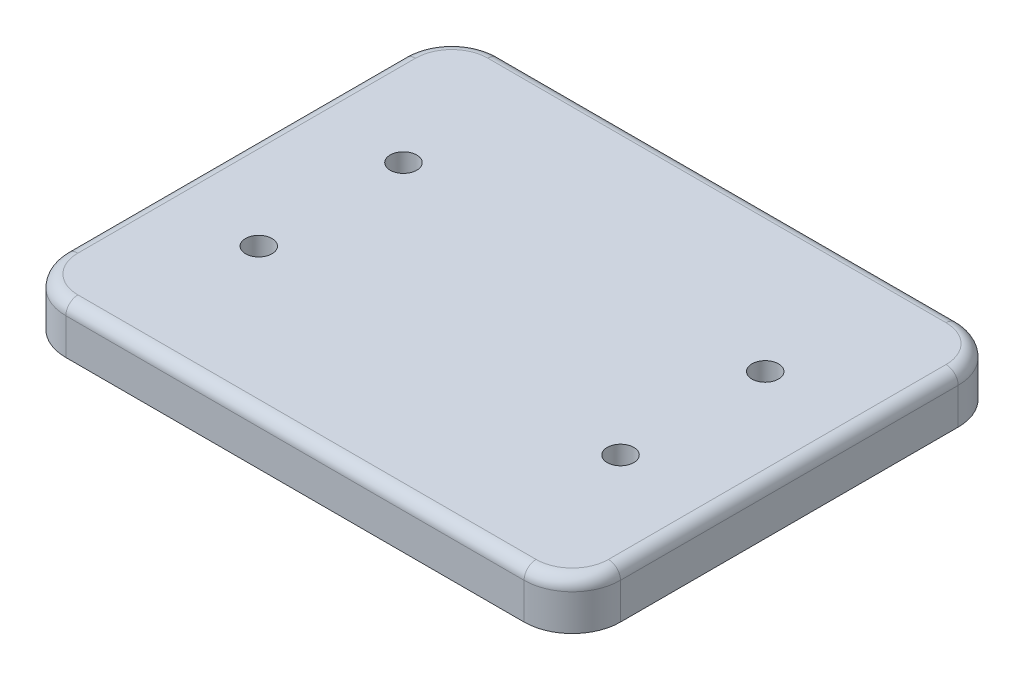
ISO-10303-21;
HEADER;
FILE_DESCRIPTION(('STEP AP214'),'2;1');
FILE_NAME('part.step','',(''),(''),'','','');
FILE_SCHEMA(('AUTOMOTIVE_DESIGN { 1 0 10303 214 1 1 1 1 }'));
ENDSEC;
DATA;
#1=APPLICATION_CONTEXT('core data for automotive mechanical design processes');
#2=APPLICATION_PROTOCOL_DEFINITION('international standard','automotive_design',2000,#1);
#3=PRODUCT_CONTEXT('',#1,'mechanical');
#4=PRODUCT('Part','Part','',(#3));
#5=PRODUCT_RELATED_PRODUCT_CATEGORY('part','',(#4));
#6=PRODUCT_DEFINITION_FORMATION('','',#4);
#7=PRODUCT_DEFINITION_CONTEXT('part definition',#1,'design');
#8=PRODUCT_DEFINITION('design','',#6,#7);
#9=PRODUCT_DEFINITION_SHAPE('','',#8);
#10=(LENGTH_UNIT() NAMED_UNIT(*) SI_UNIT(.MILLI.,.METRE.));
#11=(NAMED_UNIT(*) PLANE_ANGLE_UNIT() SI_UNIT($,.RADIAN.));
#12=(NAMED_UNIT(*) SI_UNIT($,.STERADIAN.) SOLID_ANGLE_UNIT());
#13=UNCERTAINTY_MEASURE_WITH_UNIT(LENGTH_MEASURE(1.E-05),#10,'distance_accuracy_value','');
#14=(GEOMETRIC_REPRESENTATION_CONTEXT(3) GLOBAL_UNCERTAINTY_ASSIGNED_CONTEXT((#13)) GLOBAL_UNIT_ASSIGNED_CONTEXT((#10,
#11,#12)) REPRESENTATION_CONTEXT('',''));
#15=CARTESIAN_POINT('',(0.,0.,0.));
#16=DIRECTION('',(0.,0.,1.));
#17=DIRECTION('',(1.,0.,0.));
#18=AXIS2_PLACEMENT_3D('',#15,#16,#17);
#19=CARTESIAN_POINT('',(75.,36.,30.));
#20=DIRECTION('',(0.,-1.,0.));
#21=DIRECTION('',(0.,0.,-1.));
#22=AXIS2_PLACEMENT_3D('',#19,#20,#21);
#23=CYLINDRICAL_SURFACE('',#22,5.49999999999999);
#24=CARTESIAN_POINT('',(75.,20.,30.));
#25=DIRECTION('',(0.,-1.,0.));
#26=DIRECTION('',(0.,0.,-1.));
#27=AXIS2_PLACEMENT_3D('',#24,#25,#26);
#28=CIRCLE('',#27,5.49999999999999);
#29=CARTESIAN_POINT('',(75.,20.,24.5));
#30=VERTEX_POINT('',#29);
#31=EDGE_CURVE('E250',#30,#30,#28,.T.);
#32=ORIENTED_EDGE('',*,*,#31,.F.);
#33=EDGE_LOOP('',(#32));
#34=FACE_BOUND('',#33,.T.);
#35=CARTESIAN_POINT('',(75.,11.,30.));
#36=DIRECTION('',(0.,-1.,0.));
#37=DIRECTION('',(0.,0.,-1.));
#38=AXIS2_PLACEMENT_3D('',#35,#36,#37);
#39=CIRCLE('',#38,5.49999999999999);
#40=CARTESIAN_POINT('',(75.,11.,24.5));
#41=VERTEX_POINT('',#40);
#42=EDGE_CURVE('E46',#41,#41,#39,.F.);
#43=ORIENTED_EDGE('',*,*,#42,.F.);
#44=EDGE_LOOP('',(#43));
#45=FACE_BOUND('',#44,.T.);
#46=ADVANCED_FACE('F42',(#34,#45),#23,.F.);
#47=CARTESIAN_POINT('',(-75.,36.,30.));
#48=DIRECTION('',(0.,-1.,0.));
#49=DIRECTION('',(0.,0.,-1.));
#50=AXIS2_PLACEMENT_3D('',#47,#48,#49);
#51=CYLINDRICAL_SURFACE('',#50,5.5);
#52=CARTESIAN_POINT('',(-75.,20.,30.));
#53=DIRECTION('',(0.,-1.,0.));
#54=DIRECTION('',(0.,0.,-1.));
#55=AXIS2_PLACEMENT_3D('',#52,#53,#54);
#56=CIRCLE('',#55,5.5);
#57=CARTESIAN_POINT('',(-75.,20.,24.5));
#58=VERTEX_POINT('',#57);
#59=EDGE_CURVE('E267',#58,#58,#56,.T.);
#60=ORIENTED_EDGE('',*,*,#59,.F.);
#61=EDGE_LOOP('',(#60));
#62=FACE_BOUND('',#61,.T.);
#63=CARTESIAN_POINT('',(-75.,11.,30.));
#64=DIRECTION('',(0.,-1.,0.));
#65=DIRECTION('',(0.,0.,-1.));
#66=AXIS2_PLACEMENT_3D('',#63,#64,#65);
#67=CIRCLE('',#66,5.5);
#68=CARTESIAN_POINT('',(-75.,11.,24.5));
#69=VERTEX_POINT('',#68);
#70=EDGE_CURVE('E244',#69,#69,#67,.F.);
#71=ORIENTED_EDGE('',*,*,#70,.F.);
#72=EDGE_LOOP('',(#71));
#73=FACE_BOUND('',#72,.T.);
#74=ADVANCED_FACE('F354',(#62,#73),#51,.F.);
#75=CARTESIAN_POINT('',(75.,36.,-30.));
#76=DIRECTION('',(0.,-1.,0.));
#77=DIRECTION('',(0.,0.,-1.));
#78=AXIS2_PLACEMENT_3D('',#75,#76,#77);
#79=CYLINDRICAL_SURFACE('',#78,5.49999999999999);
#80=CARTESIAN_POINT('',(75.,20.,-30.));
#81=DIRECTION('',(0.,-1.,0.));
#82=DIRECTION('',(0.,0.,-1.));
#83=AXIS2_PLACEMENT_3D('',#80,#81,#82);
#84=CIRCLE('',#83,5.49999999999999);
#85=CARTESIAN_POINT('',(75.,20.,-35.5));
#86=VERTEX_POINT('',#85);
#87=EDGE_CURVE('E243',#86,#86,#84,.F.);
#88=ORIENTED_EDGE('',*,*,#87,.T.);
#89=EDGE_LOOP('',(#88));
#90=FACE_BOUND('',#89,.T.);
#91=CARTESIAN_POINT('',(75.,11.,-30.));
#92=DIRECTION('',(0.,-1.,0.));
#93=DIRECTION('',(0.,0.,-1.));
#94=AXIS2_PLACEMENT_3D('',#91,#92,#93);
#95=CIRCLE('',#94,5.49999999999999);
#96=CARTESIAN_POINT('',(75.,11.,-35.5));
#97=VERTEX_POINT('',#96);
#98=EDGE_CURVE('E240',#97,#97,#95,.T.);
#99=ORIENTED_EDGE('',*,*,#98,.T.);
#100=EDGE_LOOP('',(#99));
#101=FACE_BOUND('',#100,.T.);
#102=ADVANCED_FACE('F360',(#90,#101),#79,.F.);
#103=CARTESIAN_POINT('',(-75.,36.,-30.));
#104=DIRECTION('',(0.,-1.,0.));
#105=DIRECTION('',(0.,0.,-1.));
#106=AXIS2_PLACEMENT_3D('',#103,#104,#105);
#107=CYLINDRICAL_SURFACE('',#106,5.5);
#108=CARTESIAN_POINT('',(-75.,20.,-30.));
#109=DIRECTION('',(0.,-1.,0.));
#110=DIRECTION('',(0.,0.,-1.));
#111=AXIS2_PLACEMENT_3D('',#108,#109,#110);
#112=CIRCLE('',#111,5.5);
#113=CARTESIAN_POINT('',(-75.,20.,-35.5));
#114=VERTEX_POINT('',#113);
#115=EDGE_CURVE('E160',#114,#114,#112,.F.);
#116=ORIENTED_EDGE('',*,*,#115,.T.);
#117=EDGE_LOOP('',(#116));
#118=FACE_BOUND('',#117,.T.);
#119=CARTESIAN_POINT('',(-75.,11.,-30.));
#120=DIRECTION('',(0.,-1.,0.));
#121=DIRECTION('',(0.,0.,-1.));
#122=AXIS2_PLACEMENT_3D('',#119,#120,#121);
#123=CIRCLE('',#122,5.5);
#124=CARTESIAN_POINT('',(-75.,11.,-35.5));
#125=VERTEX_POINT('',#124);
#126=EDGE_CURVE('E237',#125,#125,#123,.T.);
#127=ORIENTED_EDGE('',*,*,#126,.T.);
#128=EDGE_LOOP('',(#127));
#129=FACE_BOUND('',#128,.T.);
#130=ADVANCED_FACE('F286',(#118,#129),#107,.F.);
#131=CARTESIAN_POINT('',(-95.,20.,70.));
#132=DIRECTION('',(0.,-1.,0.));
#133=DIRECTION('',(0.,0.,-1.));
#134=AXIS2_PLACEMENT_3D('',#131,#132,#133);
#135=CYLINDRICAL_SURFACE('',#134,20.);
#136=DIRECTION('',(0.,-1.,0.));
#137=VECTOR('',#136,1.);
#138=CARTESIAN_POINT('',(-94.9999999999998,20.,90.));
#139=LINE('',#138,#137);
#140=CARTESIAN_POINT('',(-94.9999999999998,15.,90.));
#141=VERTEX_POINT('',#140);
#142=CARTESIAN_POINT('',(-94.9999999999998,0.,90.));
#143=VERTEX_POINT('',#142);
#144=EDGE_CURVE('E130',#141,#143,#139,.T.);
#145=ORIENTED_EDGE('',*,*,#144,.F.);
#146=CARTESIAN_POINT('',(-95.,15.,70.));
#147=DIRECTION('',(0.,-1.,0.));
#148=DIRECTION('',(0.,0.,-1.));
#149=AXIS2_PLACEMENT_3D('',#146,#147,#148);
#150=CIRCLE('',#149,20.);
#151=CARTESIAN_POINT('',(-115.,15.,69.9999999999998));
#152=VERTEX_POINT('',#151);
#153=EDGE_CURVE('E11',#141,#152,#150,.T.);
#154=ORIENTED_EDGE('',*,*,#153,.T.);
#155=DIRECTION('',(0.,-1.,0.));
#156=VECTOR('',#155,1.);
#157=CARTESIAN_POINT('',(-115.,20.,69.9999999999998));
#158=LINE('',#157,#156);
#159=CARTESIAN_POINT('',(-115.,0.,69.9999999999998));
#160=VERTEX_POINT('',#159);
#161=EDGE_CURVE('E152',#152,#160,#158,.T.);
#162=ORIENTED_EDGE('',*,*,#161,.T.);
#163=CARTESIAN_POINT('',(-95.,0.,70.));
#164=DIRECTION('',(0.,1.,0.));
#165=DIRECTION('',(0.,0.,-1.));
#166=AXIS2_PLACEMENT_3D('',#163,#164,#165);
#167=CIRCLE('',#166,20.);
#168=EDGE_CURVE('E145',#160,#143,#167,.T.);
#169=ORIENTED_EDGE('',*,*,#168,.T.);
#170=EDGE_LOOP('',(#145,#154,#162,#169));
#171=FACE_BOUND('',#170,.T.);
#172=ADVANCED_FACE('F150',(#171),#135,.T.);
#173=CARTESIAN_POINT('',(-94.9999999999998,20.,90.));
#174=DIRECTION('',(0.,0.,-1.));
#175=DIRECTION('',(-1.,0.,0.));
#176=AXIS2_PLACEMENT_3D('',#173,#174,#175);
#177=PLANE('',#176);
#178=DIRECTION('',(0.,-1.,0.));
#179=VECTOR('',#178,1.);
#180=CARTESIAN_POINT('',(94.9999999999999,20.,90.));
#181=LINE('',#180,#179);
#182=CARTESIAN_POINT('',(94.9999999999999,15.,90.));
#183=VERTEX_POINT('',#182);
#184=CARTESIAN_POINT('',(94.9999999999999,0.,90.));
#185=VERTEX_POINT('',#184);
#186=EDGE_CURVE('E139',#183,#185,#181,.T.);
#187=ORIENTED_EDGE('',*,*,#186,.F.);
#188=DIRECTION('',(1.,0.,0.));
#189=VECTOR('',#188,1.);
#190=CARTESIAN_POINT('',(-94.9999999999998,15.,90.));
#191=LINE('',#190,#189);
#192=EDGE_CURVE('E51',#183,#141,#191,.F.);
#193=ORIENTED_EDGE('',*,*,#192,.T.);
#194=ORIENTED_EDGE('',*,*,#144,.T.);
#195=DIRECTION('',(1.,0.,0.));
#196=VECTOR('',#195,1.);
#197=CARTESIAN_POINT('',(-94.9999999999998,0.,90.));
#198=LINE('',#197,#196);
#199=EDGE_CURVE('E133',#143,#185,#198,.T.);
#200=ORIENTED_EDGE('',*,*,#199,.T.);
#201=EDGE_LOOP('',(#187,#193,#194,#200));
#202=FACE_BOUND('',#201,.T.);
#203=ADVANCED_FACE('F132',(#202),#177,.F.);
#204=CARTESIAN_POINT('',(95.,20.,70.));
#205=DIRECTION('',(0.,-1.,0.));
#206=DIRECTION('',(0.,0.,-1.));
#207=AXIS2_PLACEMENT_3D('',#204,#205,#206);
#208=CYLINDRICAL_SURFACE('',#207,20.);
#209=DIRECTION('',(0.,-1.,0.));
#210=VECTOR('',#209,1.);
#211=CARTESIAN_POINT('',(115.,20.,69.9999999999998));
#212=LINE('',#211,#210);
#213=CARTESIAN_POINT('',(115.,15.,69.9999999999998));
#214=VERTEX_POINT('',#213);
#215=CARTESIAN_POINT('',(115.,0.,69.9999999999998));
#216=VERTEX_POINT('',#215);
#217=EDGE_CURVE('E187',#214,#216,#212,.T.);
#218=ORIENTED_EDGE('',*,*,#217,.F.);
#219=CARTESIAN_POINT('',(95.,15.,70.));
#220=DIRECTION('',(0.,-1.,0.));
#221=DIRECTION('',(0.,0.,-1.));
#222=AXIS2_PLACEMENT_3D('',#219,#220,#221);
#223=CIRCLE('',#222,20.);
#224=EDGE_CURVE('E66',#214,#183,#223,.T.);
#225=ORIENTED_EDGE('',*,*,#224,.T.);
#226=ORIENTED_EDGE('',*,*,#186,.T.);
#227=CARTESIAN_POINT('',(95.,0.,70.));
#228=DIRECTION('',(0.,1.,0.));
#229=DIRECTION('',(0.,0.,1.));
#230=AXIS2_PLACEMENT_3D('',#227,#228,#229);
#231=CIRCLE('',#230,20.);
#232=EDGE_CURVE('E148',#185,#216,#231,.T.);
#233=ORIENTED_EDGE('',*,*,#232,.T.);
#234=EDGE_LOOP('',(#218,#225,#226,#233));
#235=FACE_BOUND('',#234,.T.);
#236=ADVANCED_FACE('F604',(#235),#208,.T.);
#237=CARTESIAN_POINT('',(115.,20.,-69.9999999999999));
#238=DIRECTION('',(-1.,0.,0.));
#239=DIRECTION('',(0.,0.,1.));
#240=AXIS2_PLACEMENT_3D('',#237,#238,#239);
#241=PLANE('',#240);
#242=DIRECTION('',(0.,-1.,0.));
#243=VECTOR('',#242,1.);
#244=CARTESIAN_POINT('',(115.,20.,-69.9999999999999));
#245=LINE('',#244,#243);
#246=CARTESIAN_POINT('',(115.,15.,-69.9999999999999));
#247=VERTEX_POINT('',#246);
#248=CARTESIAN_POINT('',(115.,0.,-69.9999999999999));
#249=VERTEX_POINT('',#248);
#250=EDGE_CURVE('E185',#247,#249,#245,.T.);
#251=ORIENTED_EDGE('',*,*,#250,.F.);
#252=DIRECTION('',(0.,0.,-1.));
#253=VECTOR('',#252,1.);
#254=CARTESIAN_POINT('',(115.,15.,-69.9999999999999));
#255=LINE('',#254,#253);
#256=EDGE_CURVE('E215',#247,#214,#255,.F.);
#257=ORIENTED_EDGE('',*,*,#256,.T.);
#258=ORIENTED_EDGE('',*,*,#217,.T.);
#259=DIRECTION('',(0.,0.,-1.));
#260=VECTOR('',#259,1.);
#261=CARTESIAN_POINT('',(115.,0.,-69.9999999999999));
#262=LINE('',#261,#260);
#263=EDGE_CURVE('E164',#216,#249,#262,.T.);
#264=ORIENTED_EDGE('',*,*,#263,.T.);
#265=EDGE_LOOP('',(#251,#257,#258,#264));
#266=FACE_BOUND('',#265,.T.);
#267=ADVANCED_FACE('F595',(#266),#241,.F.);
#268=CARTESIAN_POINT('',(95.,20.,-70.));
#269=DIRECTION('',(0.,-1.,0.));
#270=DIRECTION('',(0.,0.,-1.));
#271=AXIS2_PLACEMENT_3D('',#268,#269,#270);
#272=CYLINDRICAL_SURFACE('',#271,20.);
#273=DIRECTION('',(0.,-1.,0.));
#274=VECTOR('',#273,1.);
#275=CARTESIAN_POINT('',(94.9999999999998,20.,-90.));
#276=LINE('',#275,#274);
#277=CARTESIAN_POINT('',(94.9999999999998,15.,-90.));
#278=VERTEX_POINT('',#277);
#279=CARTESIAN_POINT('',(94.9999999999998,0.,-90.));
#280=VERTEX_POINT('',#279);
#281=EDGE_CURVE('E183',#278,#280,#276,.T.);
#282=ORIENTED_EDGE('',*,*,#281,.F.);
#283=CARTESIAN_POINT('',(95.,15.,-70.));
#284=DIRECTION('',(0.,-1.,0.));
#285=DIRECTION('',(0.,0.,-1.));
#286=AXIS2_PLACEMENT_3D('',#283,#284,#285);
#287=CIRCLE('',#286,20.);
#288=EDGE_CURVE('E213',#278,#247,#287,.T.);
#289=ORIENTED_EDGE('',*,*,#288,.T.);
#290=ORIENTED_EDGE('',*,*,#250,.T.);
#291=CARTESIAN_POINT('',(95.,0.,-70.));
#292=DIRECTION('',(0.,1.,0.));
#293=DIRECTION('',(0.,0.,-1.));
#294=AXIS2_PLACEMENT_3D('',#291,#292,#293);
#295=CIRCLE('',#294,20.);
#296=EDGE_CURVE('E167',#249,#280,#295,.T.);
#297=ORIENTED_EDGE('',*,*,#296,.T.);
#298=EDGE_LOOP('',(#282,#289,#290,#297));
#299=FACE_BOUND('',#298,.T.);
#300=ADVANCED_FACE('F337',(#299),#272,.T.);
#301=CARTESIAN_POINT('',(-94.9999999999999,20.,-90.));
#302=DIRECTION('',(0.,0.,1.));
#303=DIRECTION('',(1.,0.,0.));
#304=AXIS2_PLACEMENT_3D('',#301,#302,#303);
#305=PLANE('',#304);
#306=DIRECTION('',(0.,-1.,0.));
#307=VECTOR('',#306,1.);
#308=CARTESIAN_POINT('',(-94.9999999999999,20.,-90.));
#309=LINE('',#308,#307);
#310=CARTESIAN_POINT('',(-94.9999999999999,15.,-90.));
#311=VERTEX_POINT('',#310);
#312=CARTESIAN_POINT('',(-94.9999999999999,0.,-90.));
#313=VERTEX_POINT('',#312);
#314=EDGE_CURVE('E181',#311,#313,#309,.T.);
#315=ORIENTED_EDGE('',*,*,#314,.F.);
#316=DIRECTION('',(-1.,0.,0.));
#317=VECTOR('',#316,1.);
#318=CARTESIAN_POINT('',(-94.9999999999999,15.,-90.));
#319=LINE('',#318,#317);
#320=EDGE_CURVE('E211',#311,#278,#319,.F.);
#321=ORIENTED_EDGE('',*,*,#320,.T.);
#322=ORIENTED_EDGE('',*,*,#281,.T.);
#323=DIRECTION('',(-1.,0.,0.));
#324=VECTOR('',#323,1.);
#325=CARTESIAN_POINT('',(-94.9999999999999,0.,-90.));
#326=LINE('',#325,#324);
#327=EDGE_CURVE('E170',#280,#313,#326,.T.);
#328=ORIENTED_EDGE('',*,*,#327,.T.);
#329=EDGE_LOOP('',(#315,#321,#322,#328));
#330=FACE_BOUND('',#329,.T.);
#331=ADVANCED_FACE('F335',(#330),#305,.F.);
#332=CARTESIAN_POINT('',(-95.,20.,-70.));
#333=DIRECTION('',(0.,-1.,0.));
#334=DIRECTION('',(0.,0.,-1.));
#335=AXIS2_PLACEMENT_3D('',#332,#333,#334);
#336=CYLINDRICAL_SURFACE('',#335,20.);
#337=DIRECTION('',(0.,-1.,0.));
#338=VECTOR('',#337,1.);
#339=CARTESIAN_POINT('',(-115.,20.,-69.9999999999999));
#340=LINE('',#339,#338);
#341=CARTESIAN_POINT('',(-115.,15.,-69.9999999999999));
#342=VERTEX_POINT('',#341);
#343=CARTESIAN_POINT('',(-115.,0.,-69.9999999999999));
#344=VERTEX_POINT('',#343);
#345=EDGE_CURVE('E179',#342,#344,#340,.T.);
#346=ORIENTED_EDGE('',*,*,#345,.F.);
#347=CARTESIAN_POINT('',(-95.,15.,-70.));
#348=DIRECTION('',(0.,-1.,0.));
#349=DIRECTION('',(0.,0.,-1.));
#350=AXIS2_PLACEMENT_3D('',#347,#348,#349);
#351=CIRCLE('',#350,20.);
#352=EDGE_CURVE('E209',#342,#311,#351,.T.);
#353=ORIENTED_EDGE('',*,*,#352,.T.);
#354=ORIENTED_EDGE('',*,*,#314,.T.);
#355=CARTESIAN_POINT('',(-95.,0.,-70.));
#356=DIRECTION('',(0.,1.,0.));
#357=DIRECTION('',(0.,0.,1.));
#358=AXIS2_PLACEMENT_3D('',#355,#356,#357);
#359=CIRCLE('',#358,20.);
#360=EDGE_CURVE('E173',#313,#344,#359,.T.);
#361=ORIENTED_EDGE('',*,*,#360,.T.);
#362=EDGE_LOOP('',(#346,#353,#354,#361));
#363=FACE_BOUND('',#362,.T.);
#364=ADVANCED_FACE('F344',(#363),#336,.T.);
#365=CARTESIAN_POINT('',(-115.,20.,-69.9999999999999));
#366=DIRECTION('',(1.,0.,0.));
#367=DIRECTION('',(0.,0.,-1.));
#368=AXIS2_PLACEMENT_3D('',#365,#366,#367);
#369=PLANE('',#368);
#370=ORIENTED_EDGE('',*,*,#161,.F.);
#371=DIRECTION('',(0.,0.,1.));
#372=VECTOR('',#371,1.);
#373=CARTESIAN_POINT('',(-115.,15.,-69.9999999999999));
#374=LINE('',#373,#372);
#375=EDGE_CURVE('E206',#152,#342,#374,.F.);
#376=ORIENTED_EDGE('',*,*,#375,.T.);
#377=ORIENTED_EDGE('',*,*,#345,.T.);
#378=DIRECTION('',(0.,0.,1.));
#379=VECTOR('',#378,1.);
#380=CARTESIAN_POINT('',(-115.,0.,-69.9999999999999));
#381=LINE('',#380,#379);
#382=EDGE_CURVE('E176',#344,#160,#381,.T.);
#383=ORIENTED_EDGE('',*,*,#382,.T.);
#384=EDGE_LOOP('',(#370,#376,#377,#383));
#385=FACE_BOUND('',#384,.T.);
#386=ADVANCED_FACE('F292',(#385),#369,.F.);
#387=CARTESIAN_POINT('',(-95.,20.,70.));
#388=DIRECTION('',(0.,-1.,0.));
#389=DIRECTION('',(0.,0.,-1.));
#390=AXIS2_PLACEMENT_3D('',#387,#388,#389);
#391=PLANE('',#390);
#392=ORIENTED_EDGE('',*,*,#59,.T.);
#393=EDGE_LOOP('',(#392));
#394=FACE_BOUND('',#393,.T.);
#395=ORIENTED_EDGE('',*,*,#31,.T.);
#396=EDGE_LOOP('',(#395));
#397=FACE_BOUND('',#396,.T.);
#398=ORIENTED_EDGE('',*,*,#115,.F.);
#399=EDGE_LOOP('',(#398));
#400=FACE_BOUND('',#399,.T.);
#401=ORIENTED_EDGE('',*,*,#87,.F.);
#402=EDGE_LOOP('',(#401));
#403=FACE_BOUND('',#402,.T.);
#404=CARTESIAN_POINT('',(-95.,20.,-70.));
#405=DIRECTION('',(0.,-1.,0.));
#406=DIRECTION('',(0.,0.,-1.));
#407=AXIS2_PLACEMENT_3D('',#404,#405,#406);
#408=CIRCLE('',#407,15.);
#409=CARTESIAN_POINT('',(-94.9999999999999,20.,-85.));
#410=VERTEX_POINT('',#409);
#411=CARTESIAN_POINT('',(-110.,20.,-69.9999999999999));
#412=VERTEX_POINT('',#411);
#413=EDGE_CURVE('E201',#410,#412,#408,.F.);
#414=ORIENTED_EDGE('',*,*,#413,.T.);
#415=DIRECTION('',(0.,0.,1.));
#416=VECTOR('',#415,1.);
#417=CARTESIAN_POINT('',(-110.,20.,70.));
#418=LINE('',#417,#416);
#419=CARTESIAN_POINT('',(-110.,20.,69.9999999999998));
#420=VERTEX_POINT('',#419);
#421=EDGE_CURVE('E203',#412,#420,#418,.T.);
#422=ORIENTED_EDGE('',*,*,#421,.T.);
#423=CARTESIAN_POINT('',(-95.,20.,70.));
#424=DIRECTION('',(0.,-1.,0.));
#425=DIRECTION('',(0.,0.,-1.));
#426=AXIS2_PLACEMENT_3D('',#423,#424,#425);
#427=CIRCLE('',#426,15.);
#428=CARTESIAN_POINT('',(-94.9999999999998,20.,85.));
#429=VERTEX_POINT('',#428);
#430=EDGE_CURVE('E138',#420,#429,#427,.F.);
#431=ORIENTED_EDGE('',*,*,#430,.T.);
#432=DIRECTION('',(1.,0.,0.));
#433=VECTOR('',#432,1.);
#434=CARTESIAN_POINT('',(-95.,20.,85.));
#435=LINE('',#434,#433);
#436=CARTESIAN_POINT('',(94.9999999999999,20.,85.));
#437=VERTEX_POINT('',#436);
#438=EDGE_CURVE('E191',#429,#437,#435,.T.);
#439=ORIENTED_EDGE('',*,*,#438,.T.);
#440=CARTESIAN_POINT('',(95.,20.,70.));
#441=DIRECTION('',(0.,-1.,0.));
#442=DIRECTION('',(0.,0.,-1.));
#443=AXIS2_PLACEMENT_3D('',#440,#441,#442);
#444=CIRCLE('',#443,15.);
#445=CARTESIAN_POINT('',(110.,20.,69.9999999999998));
#446=VERTEX_POINT('',#445);
#447=EDGE_CURVE('E193',#437,#446,#444,.F.);
#448=ORIENTED_EDGE('',*,*,#447,.T.);
#449=DIRECTION('',(0.,0.,-1.));
#450=VECTOR('',#449,1.);
#451=CARTESIAN_POINT('',(110.,20.,69.9999999999999));
#452=LINE('',#451,#450);
#453=CARTESIAN_POINT('',(110.,20.,-69.9999999999999));
#454=VERTEX_POINT('',#453);
#455=EDGE_CURVE('E195',#446,#454,#452,.T.);
#456=ORIENTED_EDGE('',*,*,#455,.T.);
#457=CARTESIAN_POINT('',(95.,20.,-70.));
#458=DIRECTION('',(0.,-1.,0.));
#459=DIRECTION('',(0.,0.,-1.));
#460=AXIS2_PLACEMENT_3D('',#457,#458,#459);
#461=CIRCLE('',#460,15.);
#462=CARTESIAN_POINT('',(94.9999999999998,20.,-85.));
#463=VERTEX_POINT('',#462);
#464=EDGE_CURVE('E197',#454,#463,#461,.F.);
#465=ORIENTED_EDGE('',*,*,#464,.T.);
#466=DIRECTION('',(-1.,0.,0.));
#467=VECTOR('',#466,1.);
#468=CARTESIAN_POINT('',(-95.,20.,-85.));
#469=LINE('',#468,#467);
#470=EDGE_CURVE('E199',#463,#410,#469,.T.);
#471=ORIENTED_EDGE('',*,*,#470,.T.);
#472=EDGE_LOOP('',(#414,#422,#431,#439,#448,#456,#465,#471));
#473=FACE_BOUND('',#472,.T.);
#474=ADVANCED_FACE('F289',(#394,#397,#400,#403,#473),#391,.F.);
#475=CARTESIAN_POINT('',(-95.,0.,70.));
#476=DIRECTION('',(0.,-1.,0.));
#477=DIRECTION('',(0.,0.,-1.));
#478=AXIS2_PLACEMENT_3D('',#475,#476,#477);
#479=PLANE('',#478);
#480=CARTESIAN_POINT('',(-75.,0.,30.));
#481=DIRECTION('',(0.,1.,0.));
#482=DIRECTION('',(0.,0.,1.));
#483=AXIS2_PLACEMENT_3D('',#480,#481,#482);
#484=CIRCLE('',#483,9.);
#485=CARTESIAN_POINT('',(-75.,0.,39.));
#486=VERTEX_POINT('',#485);
#487=EDGE_CURVE('E252',#486,#486,#484,.T.);
#488=ORIENTED_EDGE('',*,*,#487,.T.);
#489=EDGE_LOOP('',(#488));
#490=FACE_BOUND('',#489,.T.);
#491=CARTESIAN_POINT('',(75.,0.,30.));
#492=DIRECTION('',(0.,1.,0.));
#493=DIRECTION('',(0.,0.,1.));
#494=AXIS2_PLACEMENT_3D('',#491,#492,#493);
#495=CIRCLE('',#494,9.);
#496=CARTESIAN_POINT('',(75.,0.,39.));
#497=VERTEX_POINT('',#496);
#498=EDGE_CURVE('E262',#497,#497,#495,.T.);
#499=ORIENTED_EDGE('',*,*,#498,.T.);
#500=EDGE_LOOP('',(#499));
#501=FACE_BOUND('',#500,.T.);
#502=CARTESIAN_POINT('',(-75.,0.,-30.));
#503=DIRECTION('',(0.,-1.,0.));
#504=DIRECTION('',(0.,0.,-1.));
#505=AXIS2_PLACEMENT_3D('',#502,#503,#504);
#506=CIRCLE('',#505,9.);
#507=CARTESIAN_POINT('',(-75.,0.,-39.));
#508=VERTEX_POINT('',#507);
#509=EDGE_CURVE('E273',#508,#508,#506,.T.);
#510=ORIENTED_EDGE('',*,*,#509,.F.);
#511=EDGE_LOOP('',(#510));
#512=FACE_BOUND('',#511,.T.);
#513=CARTESIAN_POINT('',(75.,0.,-30.));
#514=DIRECTION('',(0.,-1.,0.));
#515=DIRECTION('',(0.,0.,-1.));
#516=AXIS2_PLACEMENT_3D('',#513,#514,#515);
#517=CIRCLE('',#516,9.);
#518=CARTESIAN_POINT('',(75.,0.,-39.));
#519=VERTEX_POINT('',#518);
#520=EDGE_CURVE('E276',#519,#519,#517,.T.);
#521=ORIENTED_EDGE('',*,*,#520,.F.);
#522=EDGE_LOOP('',(#521));
#523=FACE_BOUND('',#522,.T.);
#524=ORIENTED_EDGE('',*,*,#168,.F.);
#525=ORIENTED_EDGE('',*,*,#382,.F.);
#526=ORIENTED_EDGE('',*,*,#360,.F.);
#527=ORIENTED_EDGE('',*,*,#327,.F.);
#528=ORIENTED_EDGE('',*,*,#296,.F.);
#529=ORIENTED_EDGE('',*,*,#263,.F.);
#530=ORIENTED_EDGE('',*,*,#232,.F.);
#531=ORIENTED_EDGE('',*,*,#199,.F.);
#532=EDGE_LOOP('',(#524,#525,#526,#527,#528,#529,#530,#531));
#533=FACE_BOUND('',#532,.T.);
#534=ADVANCED_FACE('F143',(#490,#501,#512,#523,#533),#479,.T.);
#535=CARTESIAN_POINT('',(110.,15.,69.9999999999999));
#536=DIRECTION('',(0.,0.,-1.));
#537=DIRECTION('',(-1.,0.,0.));
#538=AXIS2_PLACEMENT_3D('',#535,#536,#537);
#539=CYLINDRICAL_SURFACE('',#538,5.);
#540=CARTESIAN_POINT('',(110.,15.,69.9999999999998));
#541=DIRECTION('',(0.,0.,1.));
#542=DIRECTION('',(1.,0.,0.));
#543=AXIS2_PLACEMENT_3D('',#540,#541,#542);
#544=CIRCLE('',#543,5.);
#545=EDGE_CURVE('E157',#214,#446,#544,.T.);
#546=ORIENTED_EDGE('',*,*,#545,.F.);
#547=ORIENTED_EDGE('',*,*,#256,.F.);
#548=CARTESIAN_POINT('',(110.,15.,-69.9999999999999));
#549=DIRECTION('',(0.,0.,-1.));
#550=DIRECTION('',(-1.,0.,0.));
#551=AXIS2_PLACEMENT_3D('',#548,#549,#550);
#552=CIRCLE('',#551,5.);
#553=EDGE_CURVE('E154',#454,#247,#552,.T.);
#554=ORIENTED_EDGE('',*,*,#553,.F.);
#555=ORIENTED_EDGE('',*,*,#455,.F.);
#556=EDGE_LOOP('',(#546,#547,#554,#555));
#557=FACE_BOUND('',#556,.T.);
#558=ADVANCED_FACE('F44',(#557),#539,.T.);
#559=CARTESIAN_POINT('',(95.,15.,-70.));
#560=DIRECTION('',(0.,-1.,0.));
#561=DIRECTION('',(0.,0.,-1.));
#562=AXIS2_PLACEMENT_3D('',#559,#560,#561);
#563=TOROIDAL_SURFACE('',#562,15.,5.);
#564=ORIENTED_EDGE('',*,*,#553,.T.);
#565=ORIENTED_EDGE('',*,*,#288,.F.);
#566=CARTESIAN_POINT('',(94.9999999999998,15.,-85.));
#567=DIRECTION('',(-1.,0.,0.));
#568=DIRECTION('',(0.,0.,1.));
#569=AXIS2_PLACEMENT_3D('',#566,#567,#568);
#570=CIRCLE('',#569,5.);
#571=EDGE_CURVE('E232',#463,#278,#570,.T.);
#572=ORIENTED_EDGE('',*,*,#571,.F.);
#573=ORIENTED_EDGE('',*,*,#464,.F.);
#574=EDGE_LOOP('',(#564,#565,#572,#573));
#575=FACE_BOUND('',#574,.T.);
#576=ADVANCED_FACE('F328',(#575),#563,.T.);
#577=CARTESIAN_POINT('',(95.,15.,70.));
#578=DIRECTION('',(0.,-1.,0.));
#579=DIRECTION('',(0.,0.,-1.));
#580=AXIS2_PLACEMENT_3D('',#577,#578,#579);
#581=TOROIDAL_SURFACE('',#580,15.,5.);
#582=ORIENTED_EDGE('',*,*,#545,.T.);
#583=ORIENTED_EDGE('',*,*,#447,.F.);
#584=CARTESIAN_POINT('',(94.9999999999999,15.,85.));
#585=DIRECTION('',(-1.,0.,0.));
#586=DIRECTION('',(0.,0.,1.));
#587=AXIS2_PLACEMENT_3D('',#584,#585,#586);
#588=CIRCLE('',#587,5.);
#589=EDGE_CURVE('E229',#183,#437,#588,.T.);
#590=ORIENTED_EDGE('',*,*,#589,.F.);
#591=ORIENTED_EDGE('',*,*,#224,.F.);
#592=EDGE_LOOP('',(#582,#583,#590,#591));
#593=FACE_BOUND('',#592,.T.);
#594=ADVANCED_FACE('F318',(#593),#581,.T.);
#595=CARTESIAN_POINT('',(-95.,15.,-85.));
#596=DIRECTION('',(-1.,0.,0.));
#597=DIRECTION('',(0.,0.,1.));
#598=AXIS2_PLACEMENT_3D('',#595,#596,#597);
#599=CYLINDRICAL_SURFACE('',#598,5.);
#600=ORIENTED_EDGE('',*,*,#571,.T.);
#601=ORIENTED_EDGE('',*,*,#320,.F.);
#602=CARTESIAN_POINT('',(-94.9999999999999,15.,-85.));
#603=DIRECTION('',(-1.,0.,0.));
#604=DIRECTION('',(0.,0.,1.));
#605=AXIS2_PLACEMENT_3D('',#602,#603,#604);
#606=CIRCLE('',#605,5.);
#607=EDGE_CURVE('E226',#410,#311,#606,.T.);
#608=ORIENTED_EDGE('',*,*,#607,.F.);
#609=ORIENTED_EDGE('',*,*,#470,.F.);
#610=EDGE_LOOP('',(#600,#601,#608,#609));
#611=FACE_BOUND('',#610,.T.);
#612=ADVANCED_FACE('F331',(#611),#599,.T.);
#613=CARTESIAN_POINT('',(-95.,15.,85.));
#614=DIRECTION('',(1.,0.,0.));
#615=DIRECTION('',(0.,0.,-1.));
#616=AXIS2_PLACEMENT_3D('',#613,#614,#615);
#617=CYLINDRICAL_SURFACE('',#616,5.);
#618=ORIENTED_EDGE('',*,*,#589,.T.);
#619=ORIENTED_EDGE('',*,*,#438,.F.);
#620=CARTESIAN_POINT('',(-94.9999999999998,15.,85.));
#621=DIRECTION('',(-1.,0.,0.));
#622=DIRECTION('',(0.,0.,1.));
#623=AXIS2_PLACEMENT_3D('',#620,#621,#622);
#624=CIRCLE('',#623,5.);
#625=EDGE_CURVE('E223',#141,#429,#624,.T.);
#626=ORIENTED_EDGE('',*,*,#625,.F.);
#627=ORIENTED_EDGE('',*,*,#192,.F.);
#628=EDGE_LOOP('',(#618,#619,#626,#627));
#629=FACE_BOUND('',#628,.T.);
#630=ADVANCED_FACE('F315',(#629),#617,.T.);
#631=CARTESIAN_POINT('',(-95.,15.,-70.));
#632=DIRECTION('',(0.,-1.,0.));
#633=DIRECTION('',(0.,0.,-1.));
#634=AXIS2_PLACEMENT_3D('',#631,#632,#633);
#635=TOROIDAL_SURFACE('',#634,15.,5.);
#636=ORIENTED_EDGE('',*,*,#607,.T.);
#637=ORIENTED_EDGE('',*,*,#352,.F.);
#638=CARTESIAN_POINT('',(-110.,15.,-69.9999999999999));
#639=DIRECTION('',(0.,0.,1.));
#640=DIRECTION('',(1.,0.,0.));
#641=AXIS2_PLACEMENT_3D('',#638,#639,#640);
#642=CIRCLE('',#641,5.);
#643=EDGE_CURVE('E221',#412,#342,#642,.T.);
#644=ORIENTED_EDGE('',*,*,#643,.F.);
#645=ORIENTED_EDGE('',*,*,#413,.F.);
#646=EDGE_LOOP('',(#636,#637,#644,#645));
#647=FACE_BOUND('',#646,.T.);
#648=ADVANCED_FACE('F303',(#647),#635,.T.);
#649=CARTESIAN_POINT('',(-95.,15.,70.));
#650=DIRECTION('',(0.,-1.,0.));
#651=DIRECTION('',(0.,0.,-1.));
#652=AXIS2_PLACEMENT_3D('',#649,#650,#651);
#653=TOROIDAL_SURFACE('',#652,15.,5.);
#654=ORIENTED_EDGE('',*,*,#625,.T.);
#655=ORIENTED_EDGE('',*,*,#430,.F.);
#656=CARTESIAN_POINT('',(-110.,15.,69.9999999999999));
#657=DIRECTION('',(0.,0.,-1.));
#658=DIRECTION('',(0.,1.,0.));
#659=AXIS2_PLACEMENT_3D('',#656,#657,#658);
#660=CIRCLE('',#659,5.);
#661=EDGE_CURVE('E219',#152,#420,#660,.T.);
#662=ORIENTED_EDGE('',*,*,#661,.F.);
#663=ORIENTED_EDGE('',*,*,#153,.F.);
#664=EDGE_LOOP('',(#654,#655,#662,#663));
#665=FACE_BOUND('',#664,.T.);
#666=ADVANCED_FACE('F311',(#665),#653,.T.);
#667=CARTESIAN_POINT('',(-110.,15.,70.));
#668=DIRECTION('',(0.,0.,1.));
#669=DIRECTION('',(1.,0.,0.));
#670=AXIS2_PLACEMENT_3D('',#667,#668,#669);
#671=CYLINDRICAL_SURFACE('',#670,5.);
#672=ORIENTED_EDGE('',*,*,#643,.T.);
#673=ORIENTED_EDGE('',*,*,#375,.F.);
#674=ORIENTED_EDGE('',*,*,#661,.T.);
#675=ORIENTED_EDGE('',*,*,#421,.F.);
#676=EDGE_LOOP('',(#672,#673,#674,#675));
#677=FACE_BOUND('',#676,.T.);
#678=ADVANCED_FACE('F306',(#677),#671,.T.);
#679=CARTESIAN_POINT('',(-75.,11.,-30.));
#680=DIRECTION('',(0.,-1.,0.));
#681=DIRECTION('',(0.,0.,-1.));
#682=AXIS2_PLACEMENT_3D('',#679,#680,#681);
#683=CYLINDRICAL_SURFACE('',#682,9.);
#684=CARTESIAN_POINT('',(-75.,11.,-30.));
#685=DIRECTION('',(0.,-1.,0.));
#686=DIRECTION('',(0.,0.,-1.));
#687=AXIS2_PLACEMENT_3D('',#684,#685,#686);
#688=CIRCLE('',#687,9.);
#689=CARTESIAN_POINT('',(-75.,11.,-39.));
#690=VERTEX_POINT('',#689);
#691=EDGE_CURVE('E241',#690,#690,#688,.T.);
#692=ORIENTED_EDGE('',*,*,#691,.F.);
#693=EDGE_LOOP('',(#692));
#694=FACE_BOUND('',#693,.T.);
#695=ORIENTED_EDGE('',*,*,#509,.T.);
#696=EDGE_LOOP('',(#695));
#697=FACE_BOUND('',#696,.T.);
#698=ADVANCED_FACE('F371',(#694,#697),#683,.F.);
#699=CARTESIAN_POINT('',(-75.,11.,-30.));
#700=DIRECTION('',(0.,-1.,0.));
#701=DIRECTION('',(0.,0.,-1.));
#702=AXIS2_PLACEMENT_3D('',#699,#700,#701);
#703=PLANE('',#702);
#704=ORIENTED_EDGE('',*,*,#126,.F.);
#705=EDGE_LOOP('',(#704));
#706=FACE_BOUND('',#705,.T.);
#707=ORIENTED_EDGE('',*,*,#691,.T.);
#708=EDGE_LOOP('',(#707));
#709=FACE_BOUND('',#708,.T.);
#710=ADVANCED_FACE('F367',(#706,#709),#703,.T.);
#711=CARTESIAN_POINT('',(75.,11.,-30.));
#712=DIRECTION('',(0.,-1.,0.));
#713=DIRECTION('',(0.,0.,-1.));
#714=AXIS2_PLACEMENT_3D('',#711,#712,#713);
#715=CYLINDRICAL_SURFACE('',#714,9.);
#716=CARTESIAN_POINT('',(75.,11.,-30.));
#717=DIRECTION('',(0.,-1.,0.));
#718=DIRECTION('',(0.,0.,-1.));
#719=AXIS2_PLACEMENT_3D('',#716,#717,#718);
#720=CIRCLE('',#719,9.);
#721=CARTESIAN_POINT('',(75.,11.,-39.));
#722=VERTEX_POINT('',#721);
#723=EDGE_CURVE('E270',#722,#722,#720,.T.);
#724=ORIENTED_EDGE('',*,*,#723,.F.);
#725=EDGE_LOOP('',(#724));
#726=FACE_BOUND('',#725,.T.);
#727=ORIENTED_EDGE('',*,*,#520,.T.);
#728=EDGE_LOOP('',(#727));
#729=FACE_BOUND('',#728,.T.);
#730=ADVANCED_FACE('F370',(#726,#729),#715,.F.);
#731=CARTESIAN_POINT('',(75.,11.,-30.));
#732=DIRECTION('',(0.,-1.,0.));
#733=DIRECTION('',(0.,0.,-1.));
#734=AXIS2_PLACEMENT_3D('',#731,#732,#733);
#735=PLANE('',#734);
#736=ORIENTED_EDGE('',*,*,#98,.F.);
#737=EDGE_LOOP('',(#736));
#738=FACE_BOUND('',#737,.T.);
#739=ORIENTED_EDGE('',*,*,#723,.T.);
#740=EDGE_LOOP('',(#739));
#741=FACE_BOUND('',#740,.T.);
#742=ADVANCED_FACE('F378',(#738,#741),#735,.T.);
#743=CARTESIAN_POINT('',(-75.,11.,30.));
#744=DIRECTION('',(0.,-1.,0.));
#745=DIRECTION('',(0.,0.,1.));
#746=AXIS2_PLACEMENT_3D('',#743,#744,#745);
#747=PLANE('',#746);
#748=CARTESIAN_POINT('',(-75.,11.,30.));
#749=DIRECTION('',(0.,1.,0.));
#750=DIRECTION('',(0.,0.,1.));
#751=AXIS2_PLACEMENT_3D('',#748,#749,#750);
#752=CIRCLE('',#751,9.);
#753=CARTESIAN_POINT('',(-75.,11.,39.));
#754=VERTEX_POINT('',#753);
#755=EDGE_CURVE('E246',#754,#754,#752,.T.);
#756=ORIENTED_EDGE('',*,*,#755,.F.);
#757=EDGE_LOOP('',(#756));
#758=FACE_BOUND('',#757,.T.);
#759=ORIENTED_EDGE('',*,*,#70,.T.);
#760=EDGE_LOOP('',(#759));
#761=FACE_BOUND('',#760,.T.);
#762=ADVANCED_FACE('F382',(#758,#761),#747,.T.);
#763=CARTESIAN_POINT('',(-75.,11.,30.));
#764=DIRECTION('',(0.,-1.,0.));
#765=DIRECTION('',(0.,0.,-1.));
#766=AXIS2_PLACEMENT_3D('',#763,#764,#765);
#767=CYLINDRICAL_SURFACE('',#766,9.);
#768=ORIENTED_EDGE('',*,*,#755,.T.);
#769=EDGE_LOOP('',(#768));
#770=FACE_BOUND('',#769,.T.);
#771=ORIENTED_EDGE('',*,*,#487,.F.);
#772=EDGE_LOOP('',(#771));
#773=FACE_BOUND('',#772,.T.);
#774=ADVANCED_FACE('F409',(#770,#773),#767,.F.);
#775=CARTESIAN_POINT('',(75.,11.,30.));
#776=DIRECTION('',(0.,-1.,0.));
#777=DIRECTION('',(0.,0.,1.));
#778=AXIS2_PLACEMENT_3D('',#775,#776,#777);
#779=PLANE('',#778);
#780=CARTESIAN_POINT('',(75.,11.,30.));
#781=DIRECTION('',(0.,1.,0.));
#782=DIRECTION('',(0.,0.,1.));
#783=AXIS2_PLACEMENT_3D('',#780,#781,#782);
#784=CIRCLE('',#783,9.);
#785=CARTESIAN_POINT('',(75.,11.,39.));
#786=VERTEX_POINT('',#785);
#787=EDGE_CURVE('E257',#786,#786,#784,.T.);
#788=ORIENTED_EDGE('',*,*,#787,.F.);
#789=EDGE_LOOP('',(#788));
#790=FACE_BOUND('',#789,.T.);
#791=ORIENTED_EDGE('',*,*,#42,.T.);
#792=EDGE_LOOP('',(#791));
#793=FACE_BOUND('',#792,.T.);
#794=ADVANCED_FACE('F404',(#790,#793),#779,.T.);
#795=CARTESIAN_POINT('',(75.,11.,30.));
#796=DIRECTION('',(0.,-1.,0.));
#797=DIRECTION('',(0.,0.,-1.));
#798=AXIS2_PLACEMENT_3D('',#795,#796,#797);
#799=CYLINDRICAL_SURFACE('',#798,9.);
#800=ORIENTED_EDGE('',*,*,#787,.T.);
#801=EDGE_LOOP('',(#800));
#802=FACE_BOUND('',#801,.T.);
#803=ORIENTED_EDGE('',*,*,#498,.F.);
#804=EDGE_LOOP('',(#803));
#805=FACE_BOUND('',#804,.T.);
#806=ADVANCED_FACE('F402',(#802,#805),#799,.F.);
#807=CLOSED_SHELL('',(#46,#74,#102,#130,#172,#203,#236,#267,#300,#331,#364,#386,#474,#534,#558,
#576,#594,#612,#630,#648,#666,#678,#698,#710,#730,#742,#762,#774,#794,#806));
#808=MANIFOLD_SOLID_BREP('B2',#807);
#809=ADVANCED_BREP_SHAPE_REPRESENTATION('',(#18,#808),#14);
#810=SHAPE_DEFINITION_REPRESENTATION(#9,#809);
ENDSEC;
END-ISO-10303-21;
